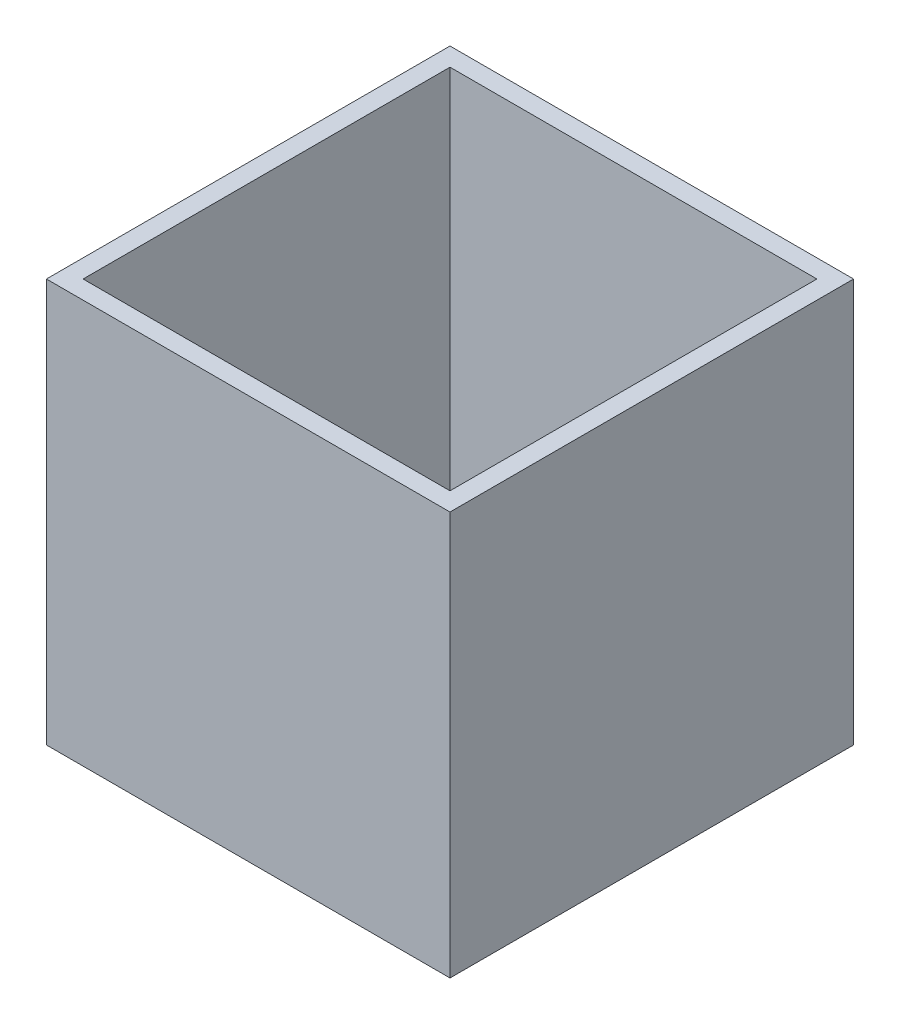
ISO-10303-21;
HEADER;
FILE_DESCRIPTION(('STEP AP214'),'2;1');
FILE_NAME('part.step','',(''),(''),'','','');
FILE_SCHEMA(('AUTOMOTIVE_DESIGN { 1 0 10303 214 1 1 1 1 }'));
ENDSEC;
DATA;
#1=APPLICATION_CONTEXT('core data for automotive mechanical design processes');
#2=APPLICATION_PROTOCOL_DEFINITION('international standard','automotive_design',2000,#1);
#3=PRODUCT_CONTEXT('',#1,'mechanical');
#4=PRODUCT('Part','Part','',(#3));
#5=PRODUCT_RELATED_PRODUCT_CATEGORY('part','',(#4));
#6=PRODUCT_DEFINITION_FORMATION('','',#4);
#7=PRODUCT_DEFINITION_CONTEXT('part definition',#1,'design');
#8=PRODUCT_DEFINITION('design','',#6,#7);
#9=PRODUCT_DEFINITION_SHAPE('','',#8);
#10=(LENGTH_UNIT() NAMED_UNIT(*) SI_UNIT(.MILLI.,.METRE.));
#11=(NAMED_UNIT(*) PLANE_ANGLE_UNIT() SI_UNIT($,.RADIAN.));
#12=(NAMED_UNIT(*) SI_UNIT($,.STERADIAN.) SOLID_ANGLE_UNIT());
#13=UNCERTAINTY_MEASURE_WITH_UNIT(LENGTH_MEASURE(1.E-05),#10,'distance_accuracy_value','');
#14=(GEOMETRIC_REPRESENTATION_CONTEXT(3) GLOBAL_UNCERTAINTY_ASSIGNED_CONTEXT((#13)) GLOBAL_UNIT_ASSIGNED_CONTEXT((#10,
#11,#12)) REPRESENTATION_CONTEXT('',''));
#15=CARTESIAN_POINT('',(0.,0.,0.));
#16=DIRECTION('',(0.,0.,1.));
#17=DIRECTION('',(1.,0.,0.));
#18=AXIS2_PLACEMENT_3D('',#15,#16,#17);
#19=CARTESIAN_POINT('',(55.88,27.94,27.94));
#20=DIRECTION('',(0.,-1.,0.));
#21=DIRECTION('',(0.,0.,-1.));
#22=AXIS2_PLACEMENT_3D('',#19,#20,#21);
#23=PLANE('',#22);
#24=DIRECTION('',(0.,0.,1.));
#25=VECTOR('',#24,1.);
#26=CARTESIAN_POINT('',(0.,27.94,27.94));
#27=LINE('',#26,#25);
#28=CARTESIAN_POINT('',(0.,27.94,-27.94));
#29=VERTEX_POINT('',#28);
#30=CARTESIAN_POINT('',(0.,27.94,27.94));
#31=VERTEX_POINT('',#30);
#32=EDGE_CURVE('E178',#29,#31,#27,.T.);
#33=ORIENTED_EDGE('',*,*,#32,.T.);
#34=DIRECTION('',(-1.,0.,0.));
#35=VECTOR('',#34,1.);
#36=CARTESIAN_POINT('',(55.88,27.94,27.94));
#37=LINE('',#36,#35);
#38=CARTESIAN_POINT('',(55.88,27.94,27.94));
#39=VERTEX_POINT('',#38);
#40=EDGE_CURVE('E45',#39,#31,#37,.T.);
#41=ORIENTED_EDGE('',*,*,#40,.F.);
#42=DIRECTION('',(0.,0.,1.));
#43=VECTOR('',#42,1.);
#44=CARTESIAN_POINT('',(55.88,27.94,27.94));
#45=LINE('',#44,#43);
#46=CARTESIAN_POINT('',(55.88,27.94,-27.94));
#47=VERTEX_POINT('',#46);
#48=EDGE_CURVE('E89',#47,#39,#45,.T.);
#49=ORIENTED_EDGE('',*,*,#48,.F.);
#50=DIRECTION('',(-1.,0.,0.));
#51=VECTOR('',#50,1.);
#52=CARTESIAN_POINT('',(55.88,27.94,-27.94));
#53=LINE('',#52,#51);
#54=EDGE_CURVE('E11',#47,#29,#53,.T.);
#55=ORIENTED_EDGE('',*,*,#54,.T.);
#56=EDGE_LOOP('',(#33,#41,#49,#55));
#57=FACE_BOUND('',#56,.T.);
#58=DIRECTION('',(0.,0.,1.));
#59=VECTOR('',#58,1.);
#60=CARTESIAN_POINT('',(2.54,27.94,0.));
#61=LINE('',#60,#59);
#62=CARTESIAN_POINT('',(2.54,27.94,-25.4));
#63=VERTEX_POINT('',#62);
#64=CARTESIAN_POINT('',(2.54,27.94,25.4));
#65=VERTEX_POINT('',#64);
#66=EDGE_CURVE('E136',#63,#65,#61,.T.);
#67=ORIENTED_EDGE('',*,*,#66,.F.);
#68=DIRECTION('',(-1.,0.,0.));
#69=VECTOR('',#68,1.);
#70=CARTESIAN_POINT('',(55.88,27.94,-25.4));
#71=LINE('',#70,#69);
#72=CARTESIAN_POINT('',(53.34,27.94,-25.4));
#73=VERTEX_POINT('',#72);
#74=EDGE_CURVE('E134',#73,#63,#71,.T.);
#75=ORIENTED_EDGE('',*,*,#74,.F.);
#76=DIRECTION('',(0.,0.,1.));
#77=VECTOR('',#76,1.);
#78=CARTESIAN_POINT('',(53.34,27.94,0.));
#79=LINE('',#78,#77);
#80=CARTESIAN_POINT('',(53.34,27.94,25.4));
#81=VERTEX_POINT('',#80);
#82=EDGE_CURVE('E143',#73,#81,#79,.T.);
#83=ORIENTED_EDGE('',*,*,#82,.T.);
#84=DIRECTION('',(-1.,0.,0.));
#85=VECTOR('',#84,1.);
#86=CARTESIAN_POINT('',(55.88,27.94,25.4));
#87=LINE('',#86,#85);
#88=EDGE_CURVE('E150',#81,#65,#87,.T.);
#89=ORIENTED_EDGE('',*,*,#88,.T.);
#90=EDGE_LOOP('',(#67,#75,#83,#89));
#91=FACE_BOUND('',#90,.T.);
#92=ADVANCED_FACE('F36',(#57,#91),#23,.F.);
#93=CARTESIAN_POINT('',(55.88,-27.94,-27.94));
#94=DIRECTION('',(0.,0.,1.));
#95=DIRECTION('',(1.,0.,0.));
#96=AXIS2_PLACEMENT_3D('',#93,#94,#95);
#97=PLANE('',#96);
#98=DIRECTION('',(0.,1.,0.));
#99=VECTOR('',#98,1.);
#100=CARTESIAN_POINT('',(0.,-27.94,-27.94));
#101=LINE('',#100,#99);
#102=CARTESIAN_POINT('',(0.,-27.94,-27.94));
#103=VERTEX_POINT('',#102);
#104=EDGE_CURVE('E156',#103,#29,#101,.T.);
#105=ORIENTED_EDGE('',*,*,#104,.T.);
#106=ORIENTED_EDGE('',*,*,#54,.F.);
#107=DIRECTION('',(0.,1.,0.));
#108=VECTOR('',#107,1.);
#109=CARTESIAN_POINT('',(55.88,-27.94,-27.94));
#110=LINE('',#109,#108);
#111=CARTESIAN_POINT('',(55.88,-27.94,-27.94));
#112=VERTEX_POINT('',#111);
#113=EDGE_CURVE('E164',#112,#47,#110,.T.);
#114=ORIENTED_EDGE('',*,*,#113,.F.);
#115=DIRECTION('',(-1.,0.,0.));
#116=VECTOR('',#115,1.);
#117=CARTESIAN_POINT('',(55.88,-27.94,-27.94));
#118=LINE('',#117,#116);
#119=EDGE_CURVE('E174',#112,#103,#118,.T.);
#120=ORIENTED_EDGE('',*,*,#119,.T.);
#121=EDGE_LOOP('',(#105,#106,#114,#120));
#122=FACE_BOUND('',#121,.T.);
#123=ADVANCED_FACE('F38',(#122),#97,.F.);
#124=CARTESIAN_POINT('',(55.88,-27.94,27.94));
#125=DIRECTION('',(0.,0.,-1.));
#126=DIRECTION('',(-1.,0.,0.));
#127=AXIS2_PLACEMENT_3D('',#124,#125,#126);
#128=PLANE('',#127);
#129=DIRECTION('',(0.,-1.,0.));
#130=VECTOR('',#129,1.);
#131=CARTESIAN_POINT('',(0.,-27.94,27.94));
#132=LINE('',#131,#130);
#133=CARTESIAN_POINT('',(0.,-27.94,27.94));
#134=VERTEX_POINT('',#133);
#135=EDGE_CURVE('E181',#31,#134,#132,.T.);
#136=ORIENTED_EDGE('',*,*,#135,.T.);
#137=DIRECTION('',(-1.,0.,0.));
#138=VECTOR('',#137,1.);
#139=CARTESIAN_POINT('',(55.88,-27.94,27.94));
#140=LINE('',#139,#138);
#141=CARTESIAN_POINT('',(55.88,-27.94,27.94));
#142=VERTEX_POINT('',#141);
#143=EDGE_CURVE('E188',#142,#134,#140,.T.);
#144=ORIENTED_EDGE('',*,*,#143,.F.);
#145=DIRECTION('',(0.,-1.,0.));
#146=VECTOR('',#145,1.);
#147=CARTESIAN_POINT('',(55.88,-27.94,27.94));
#148=LINE('',#147,#146);
#149=EDGE_CURVE('E169',#39,#142,#148,.T.);
#150=ORIENTED_EDGE('',*,*,#149,.F.);
#151=ORIENTED_EDGE('',*,*,#40,.T.);
#152=EDGE_LOOP('',(#136,#144,#150,#151));
#153=FACE_BOUND('',#152,.T.);
#154=ADVANCED_FACE('F196',(#153),#128,.F.);
#155=CARTESIAN_POINT('',(55.88,-27.94,27.94));
#156=DIRECTION('',(0.,1.,0.));
#157=DIRECTION('',(0.,0.,1.));
#158=AXIS2_PLACEMENT_3D('',#155,#156,#157);
#159=PLANE('',#158);
#160=DIRECTION('',(0.,0.,-1.));
#161=VECTOR('',#160,1.);
#162=CARTESIAN_POINT('',(0.,-27.94,27.94));
#163=LINE('',#162,#161);
#164=EDGE_CURVE('E82',#134,#103,#163,.T.);
#165=ORIENTED_EDGE('',*,*,#164,.T.);
#166=ORIENTED_EDGE('',*,*,#119,.F.);
#167=DIRECTION('',(0.,0.,-1.));
#168=VECTOR('',#167,1.);
#169=CARTESIAN_POINT('',(55.88,-27.94,27.94));
#170=LINE('',#169,#168);
#171=EDGE_CURVE('E61',#142,#112,#170,.T.);
#172=ORIENTED_EDGE('',*,*,#171,.F.);
#173=ORIENTED_EDGE('',*,*,#143,.T.);
#174=EDGE_LOOP('',(#165,#166,#172,#173));
#175=FACE_BOUND('',#174,.T.);
#176=ADVANCED_FACE('F204',(#175),#159,.F.);
#177=CARTESIAN_POINT('',(55.88,0.,0.));
#178=DIRECTION('',(-1.,0.,0.));
#179=DIRECTION('',(0.,0.,1.));
#180=AXIS2_PLACEMENT_3D('',#177,#178,#179);
#181=PLANE('',#180);
#182=ORIENTED_EDGE('',*,*,#113,.T.);
#183=ORIENTED_EDGE('',*,*,#48,.T.);
#184=ORIENTED_EDGE('',*,*,#149,.T.);
#185=ORIENTED_EDGE('',*,*,#171,.T.);
#186=EDGE_LOOP('',(#182,#183,#184,#185));
#187=FACE_BOUND('',#186,.T.);
#188=ADVANCED_FACE('F206',(#187),#181,.F.);
#189=CARTESIAN_POINT('',(0.,0.,0.));
#190=DIRECTION('',(-1.,0.,0.));
#191=DIRECTION('',(0.,0.,1.));
#192=AXIS2_PLACEMENT_3D('',#189,#190,#191);
#193=PLANE('',#192);
#194=ORIENTED_EDGE('',*,*,#104,.F.);
#195=ORIENTED_EDGE('',*,*,#164,.F.);
#196=ORIENTED_EDGE('',*,*,#135,.F.);
#197=ORIENTED_EDGE('',*,*,#32,.F.);
#198=EDGE_LOOP('',(#194,#195,#196,#197));
#199=FACE_BOUND('',#198,.T.);
#200=ADVANCED_FACE('F200',(#199),#193,.T.);
#201=CARTESIAN_POINT('',(55.88,-27.94,-25.4));
#202=DIRECTION('',(0.,0.,1.));
#203=DIRECTION('',(1.,0.,0.));
#204=AXIS2_PLACEMENT_3D('',#201,#202,#203);
#205=PLANE('',#204);
#206=DIRECTION('',(0.,1.,0.));
#207=VECTOR('',#206,1.);
#208=CARTESIAN_POINT('',(2.54,0.,-25.4));
#209=LINE('',#208,#207);
#210=CARTESIAN_POINT('',(2.54,-25.4,-25.4));
#211=VERTEX_POINT('',#210);
#212=EDGE_CURVE('E116',#211,#63,#209,.T.);
#213=ORIENTED_EDGE('',*,*,#212,.F.);
#214=DIRECTION('',(-1.,0.,0.));
#215=VECTOR('',#214,1.);
#216=CARTESIAN_POINT('',(55.88,-25.4,-25.4));
#217=LINE('',#216,#215);
#218=CARTESIAN_POINT('',(53.34,-25.4,-25.4));
#219=VERTEX_POINT('',#218);
#220=EDGE_CURVE('E125',#219,#211,#217,.T.);
#221=ORIENTED_EDGE('',*,*,#220,.F.);
#222=DIRECTION('',(0.,1.,0.));
#223=VECTOR('',#222,1.);
#224=CARTESIAN_POINT('',(53.34,0.,-25.4));
#225=LINE('',#224,#223);
#226=EDGE_CURVE('E52',#219,#73,#225,.T.);
#227=ORIENTED_EDGE('',*,*,#226,.T.);
#228=ORIENTED_EDGE('',*,*,#74,.T.);
#229=EDGE_LOOP('',(#213,#221,#227,#228));
#230=FACE_BOUND('',#229,.T.);
#231=ADVANCED_FACE('F132',(#230),#205,.T.);
#232=CARTESIAN_POINT('',(55.88,-27.94,25.4));
#233=DIRECTION('',(0.,0.,-1.));
#234=DIRECTION('',(-1.,0.,0.));
#235=AXIS2_PLACEMENT_3D('',#232,#233,#234);
#236=PLANE('',#235);
#237=DIRECTION('',(0.,-1.,0.));
#238=VECTOR('',#237,1.);
#239=CARTESIAN_POINT('',(2.54,0.,25.4));
#240=LINE('',#239,#238);
#241=CARTESIAN_POINT('',(2.54,-25.4,25.4));
#242=VERTEX_POINT('',#241);
#243=EDGE_CURVE('E119',#65,#242,#240,.T.);
#244=ORIENTED_EDGE('',*,*,#243,.F.);
#245=ORIENTED_EDGE('',*,*,#88,.F.);
#246=DIRECTION('',(0.,-1.,0.));
#247=VECTOR('',#246,1.);
#248=CARTESIAN_POINT('',(53.34,0.,25.4));
#249=LINE('',#248,#247);
#250=CARTESIAN_POINT('',(53.34,-25.4,25.4));
#251=VERTEX_POINT('',#250);
#252=EDGE_CURVE('E147',#81,#251,#249,.T.);
#253=ORIENTED_EDGE('',*,*,#252,.T.);
#254=DIRECTION('',(-1.,0.,0.));
#255=VECTOR('',#254,1.);
#256=CARTESIAN_POINT('',(55.88,-25.4,25.4));
#257=LINE('',#256,#255);
#258=EDGE_CURVE('E130',#251,#242,#257,.T.);
#259=ORIENTED_EDGE('',*,*,#258,.T.);
#260=EDGE_LOOP('',(#244,#245,#253,#259));
#261=FACE_BOUND('',#260,.T.);
#262=ADVANCED_FACE('F221',(#261),#236,.T.);
#263=CARTESIAN_POINT('',(55.88,-25.4,27.94));
#264=DIRECTION('',(0.,1.,0.));
#265=DIRECTION('',(0.,0.,1.));
#266=AXIS2_PLACEMENT_3D('',#263,#264,#265);
#267=PLANE('',#266);
#268=DIRECTION('',(0.,0.,-1.));
#269=VECTOR('',#268,1.);
#270=CARTESIAN_POINT('',(2.54,-25.4,0.));
#271=LINE('',#270,#269);
#272=EDGE_CURVE('E112',#242,#211,#271,.T.);
#273=ORIENTED_EDGE('',*,*,#272,.F.);
#274=ORIENTED_EDGE('',*,*,#258,.F.);
#275=DIRECTION('',(0.,0.,-1.));
#276=VECTOR('',#275,1.);
#277=CARTESIAN_POINT('',(53.34,-25.4,0.));
#278=LINE('',#277,#276);
#279=EDGE_CURVE('E128',#251,#219,#278,.T.);
#280=ORIENTED_EDGE('',*,*,#279,.T.);
#281=ORIENTED_EDGE('',*,*,#220,.T.);
#282=EDGE_LOOP('',(#273,#274,#280,#281));
#283=FACE_BOUND('',#282,.T.);
#284=ADVANCED_FACE('F126',(#283),#267,.T.);
#285=CARTESIAN_POINT('',(53.34,0.,0.));
#286=DIRECTION('',(-1.,0.,0.));
#287=DIRECTION('',(0.,0.,1.));
#288=AXIS2_PLACEMENT_3D('',#285,#286,#287);
#289=PLANE('',#288);
#290=ORIENTED_EDGE('',*,*,#226,.F.);
#291=ORIENTED_EDGE('',*,*,#279,.F.);
#292=ORIENTED_EDGE('',*,*,#252,.F.);
#293=ORIENTED_EDGE('',*,*,#82,.F.);
#294=EDGE_LOOP('',(#290,#291,#292,#293));
#295=FACE_BOUND('',#294,.T.);
#296=ADVANCED_FACE('F224',(#295),#289,.T.);
#297=CARTESIAN_POINT('',(2.54,0.,0.));
#298=DIRECTION('',(-1.,0.,0.));
#299=DIRECTION('',(0.,0.,1.));
#300=AXIS2_PLACEMENT_3D('',#297,#298,#299);
#301=PLANE('',#300);
#302=ORIENTED_EDGE('',*,*,#212,.T.);
#303=ORIENTED_EDGE('',*,*,#66,.T.);
#304=ORIENTED_EDGE('',*,*,#243,.T.);
#305=ORIENTED_EDGE('',*,*,#272,.T.);
#306=EDGE_LOOP('',(#302,#303,#304,#305));
#307=FACE_BOUND('',#306,.T.);
#308=ADVANCED_FACE('F114',(#307),#301,.F.);
#309=CLOSED_SHELL('',(#92,#123,#154,#176,#188,#200,#231,#262,#284,#296,#308));
#310=MANIFOLD_SOLID_BREP('B2',#309);
#311=ADVANCED_BREP_SHAPE_REPRESENTATION('',(#18,#310),#14);
#312=SHAPE_DEFINITION_REPRESENTATION(#9,#311);
ENDSEC;
END-ISO-10303-21;
